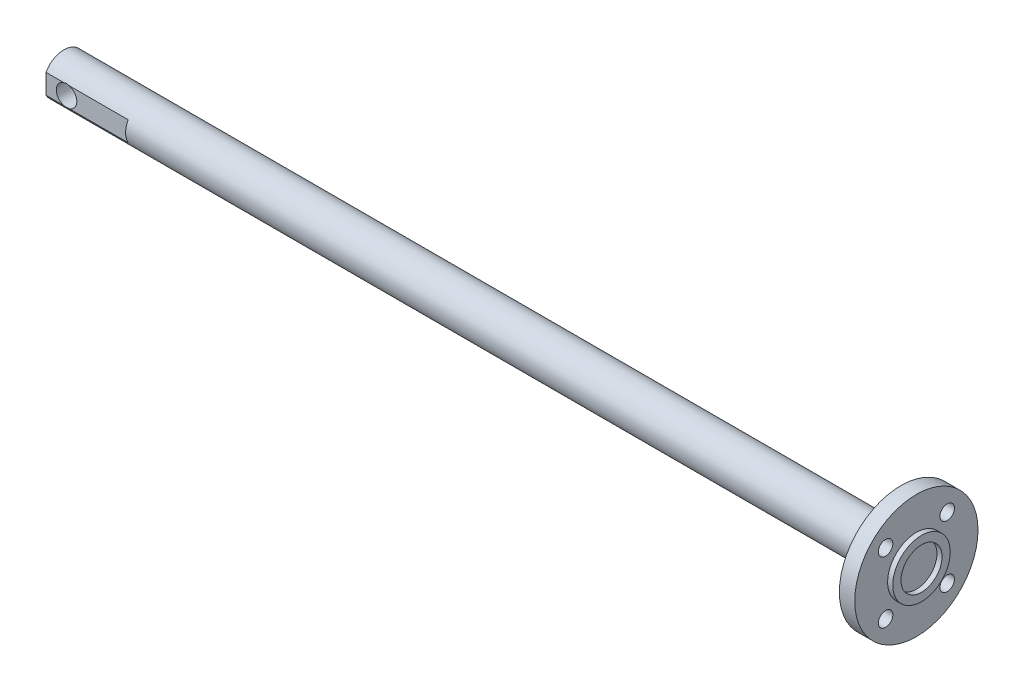
ISO-10303-21;
HEADER;
FILE_DESCRIPTION(('STEP AP214'),'2;1');
FILE_NAME('part.step','',(''),(''),'','','');
FILE_SCHEMA(('AUTOMOTIVE_DESIGN { 1 0 10303 214 1 1 1 1 }'));
ENDSEC;
DATA;
#1=APPLICATION_CONTEXT('core data for automotive mechanical design processes');
#2=APPLICATION_PROTOCOL_DEFINITION('international standard','automotive_design',2000,#1);
#3=PRODUCT_CONTEXT('',#1,'mechanical');
#4=PRODUCT('Part','Part','',(#3));
#5=PRODUCT_RELATED_PRODUCT_CATEGORY('part','',(#4));
#6=PRODUCT_DEFINITION_FORMATION('','',#4);
#7=PRODUCT_DEFINITION_CONTEXT('part definition',#1,'design');
#8=PRODUCT_DEFINITION('design','',#6,#7);
#9=PRODUCT_DEFINITION_SHAPE('','',#8);
#10=(LENGTH_UNIT() NAMED_UNIT(*) SI_UNIT(.MILLI.,.METRE.));
#11=(NAMED_UNIT(*) PLANE_ANGLE_UNIT() SI_UNIT($,.RADIAN.));
#12=(NAMED_UNIT(*) SI_UNIT($,.STERADIAN.) SOLID_ANGLE_UNIT());
#13=UNCERTAINTY_MEASURE_WITH_UNIT(LENGTH_MEASURE(1.E-05),#10,'distance_accuracy_value','');
#14=(GEOMETRIC_REPRESENTATION_CONTEXT(3) GLOBAL_UNCERTAINTY_ASSIGNED_CONTEXT((#13)) GLOBAL_UNIT_ASSIGNED_CONTEXT((#10,
#11,#12)) REPRESENTATION_CONTEXT('',''));
#15=CARTESIAN_POINT('',(0.,0.,0.));
#16=DIRECTION('',(0.,0.,1.));
#17=DIRECTION('',(1.,0.,0.));
#18=AXIS2_PLACEMENT_3D('',#15,#16,#17);
#19=CARTESIAN_POINT('',(263.525,0.,0.));
#20=DIRECTION('',(1.,0.,0.));
#21=DIRECTION('',(0.,0.,-1.));
#22=AXIS2_PLACEMENT_3D('',#19,#20,#21);
#23=PLANE('',#22);
#24=CARTESIAN_POINT('',(263.525,9.525,9.525));
#25=DIRECTION('',(1.,0.,0.));
#26=DIRECTION('',(0.,0.,-1.));
#27=AXIS2_PLACEMENT_3D('',#24,#25,#26);
#28=CIRCLE('',#27,2.2479);
#29=CARTESIAN_POINT('',(263.525,9.525,7.27710000000001));
#30=VERTEX_POINT('',#29);
#31=EDGE_CURVE('E211',#30,#30,#28,.T.);
#32=ORIENTED_EDGE('',*,*,#31,.F.);
#33=EDGE_LOOP('',(#32));
#34=FACE_BOUND('',#33,.T.);
#35=CARTESIAN_POINT('',(263.525,-9.525,-9.525));
#36=DIRECTION('',(1.,0.,0.));
#37=DIRECTION('',(0.,0.,-1.));
#38=AXIS2_PLACEMENT_3D('',#35,#36,#37);
#39=CIRCLE('',#38,2.2479);
#40=CARTESIAN_POINT('',(263.525,-9.525,-11.7729));
#41=VERTEX_POINT('',#40);
#42=EDGE_CURVE('E205',#41,#41,#39,.T.);
#43=ORIENTED_EDGE('',*,*,#42,.F.);
#44=EDGE_LOOP('',(#43));
#45=FACE_BOUND('',#44,.T.);
#46=CARTESIAN_POINT('',(263.525,9.525,-9.525));
#47=DIRECTION('',(1.,0.,0.));
#48=DIRECTION('',(0.,0.,-1.));
#49=AXIS2_PLACEMENT_3D('',#46,#47,#48);
#50=CIRCLE('',#49,2.2479);
#51=CARTESIAN_POINT('',(263.525,9.525,-11.7729));
#52=VERTEX_POINT('',#51);
#53=EDGE_CURVE('E199',#52,#52,#50,.T.);
#54=ORIENTED_EDGE('',*,*,#53,.F.);
#55=EDGE_LOOP('',(#54));
#56=FACE_BOUND('',#55,.T.);
#57=CARTESIAN_POINT('',(263.525,-9.525,9.525));
#58=DIRECTION('',(1.,0.,0.));
#59=DIRECTION('',(0.,0.,-1.));
#60=AXIS2_PLACEMENT_3D('',#57,#58,#59);
#61=CIRCLE('',#60,2.2479);
#62=CARTESIAN_POINT('',(263.525,-9.525,7.27710000000001));
#63=VERTEX_POINT('',#62);
#64=EDGE_CURVE('E175',#63,#63,#61,.T.);
#65=ORIENTED_EDGE('',*,*,#64,.F.);
#66=EDGE_LOOP('',(#65));
#67=FACE_BOUND('',#66,.T.);
#68=CARTESIAN_POINT('',(263.525,0.,0.));
#69=DIRECTION('',(1.,0.,0.));
#70=DIRECTION('',(0.,0.,-1.));
#71=AXIS2_PLACEMENT_3D('',#68,#69,#70);
#72=CIRCLE('',#71,19.05);
#73=CARTESIAN_POINT('',(263.525,0.,-19.05));
#74=VERTEX_POINT('',#73);
#75=EDGE_CURVE('E134',#74,#74,#72,.T.);
#76=ORIENTED_EDGE('',*,*,#75,.T.);
#77=EDGE_LOOP('',(#76));
#78=FACE_BOUND('',#77,.T.);
#79=CARTESIAN_POINT('',(263.525,0.,0.));
#80=DIRECTION('',(1.,0.,0.));
#81=DIRECTION('',(0.,0.,-1.));
#82=AXIS2_PLACEMENT_3D('',#79,#80,#81);
#83=CIRCLE('',#82,8.89);
#84=CARTESIAN_POINT('',(263.525,0.,-8.89));
#85=VERTEX_POINT('',#84);
#86=EDGE_CURVE('E218',#85,#85,#83,.T.);
#87=ORIENTED_EDGE('',*,*,#86,.F.);
#88=EDGE_LOOP('',(#87));
#89=FACE_BOUND('',#88,.T.);
#90=ADVANCED_FACE('F32',(#34,#45,#56,#67,#78,#89),#23,.T.);
#91=CARTESIAN_POINT('',(0.,-19.05,-5.55625));
#92=DIRECTION('',(0.,0.,1.));
#93=DIRECTION('',(1.,0.,0.));
#94=AXIS2_PLACEMENT_3D('',#91,#92,#93);
#95=PLANE('',#94);
#96=CARTESIAN_POINT('',(6.35,0.,-5.55625));
#97=DIRECTION('',(0.,0.,-1.));
#98=DIRECTION('',(-1.,0.,0.));
#99=AXIS2_PLACEMENT_3D('',#96,#97,#98);
#100=CIRCLE('',#99,3.17499999999999);
#101=CARTESIAN_POINT('',(7.14374999999996,3.07418053105213,-5.55625));
#102=VERTEX_POINT('',#101);
#103=CARTESIAN_POINT('',(7.14374999999996,-3.07418053105213,-5.55625));
#104=VERTEX_POINT('',#103);
#105=EDGE_CURVE('E97',#102,#104,#100,.T.);
#106=ORIENTED_EDGE('',*,*,#105,.F.);
#107=DIRECTION('',(-1.,0.,0.));
#108=VECTOR('',#107,1.);
#109=CARTESIAN_POINT('',(-16.5206638695174,3.07418053105214,-5.55625));
#110=LINE('',#109,#108);
#111=CARTESIAN_POINT('',(25.4,3.07418053105213,-5.55625));
#112=VERTEX_POINT('',#111);
#113=EDGE_CURVE('E109',#102,#112,#110,.F.);
#114=ORIENTED_EDGE('',*,*,#113,.T.);
#115=DIRECTION('',(0.,1.,0.));
#116=VECTOR('',#115,1.);
#117=CARTESIAN_POINT('',(25.4,-19.05,-5.55625));
#118=LINE('',#117,#116);
#119=CARTESIAN_POINT('',(25.4,-3.07418053105215,-5.55625));
#120=VERTEX_POINT('',#119);
#121=EDGE_CURVE('E178',#120,#112,#118,.T.);
#122=ORIENTED_EDGE('',*,*,#121,.F.);
#123=DIRECTION('',(-1.,0.,0.));
#124=VECTOR('',#123,1.);
#125=CARTESIAN_POINT('',(-16.5206638695174,-3.07418053105214,-5.55625));
#126=LINE('',#125,#124);
#127=EDGE_CURVE('E112',#120,#104,#126,.T.);
#128=ORIENTED_EDGE('',*,*,#127,.T.);
#129=EDGE_LOOP('',(#106,#114,#122,#128));
#130=FACE_BOUND('',#129,.T.);
#131=ADVANCED_FACE('F107',(#130),#95,.F.);
#132=CARTESIAN_POINT('',(5.55625000000004,-3.07418053105213,-5.55625));
#133=VERTEX_POINT('',#132);
#134=CARTESIAN_POINT('',(5.55625000000006,3.07418053105214,-5.55625));
#135=VERTEX_POINT('',#134);
#136=EDGE_CURVE('E47',#133,#135,#100,.T.);
#137=ORIENTED_EDGE('',*,*,#136,.F.);
#138=CARTESIAN_POINT('',(0.,-3.07418053105214,-5.55625));
#139=VERTEX_POINT('',#138);
#140=EDGE_CURVE('E121',#133,#139,#126,.T.);
#141=ORIENTED_EDGE('',*,*,#140,.T.);
#142=DIRECTION('',(0.,-1.,0.));
#143=VECTOR('',#142,1.);
#144=CARTESIAN_POINT('',(0.,0.,-5.55625));
#145=LINE('',#144,#143);
#146=CARTESIAN_POINT('',(0.,3.07418053105213,-5.55625));
#147=VERTEX_POINT('',#146);
#148=EDGE_CURVE('E137',#147,#139,#145,.T.);
#149=ORIENTED_EDGE('',*,*,#148,.F.);
#150=EDGE_CURVE('E118',#147,#135,#110,.F.);
#151=ORIENTED_EDGE('',*,*,#150,.T.);
#152=EDGE_LOOP('',(#137,#141,#149,#151));
#153=FACE_BOUND('',#152,.T.);
#154=ADVANCED_FACE('F173',(#153),#95,.F.);
#155=CARTESIAN_POINT('',(0.,-19.05,5.55625));
#156=DIRECTION('',(0.,0.,-1.));
#157=DIRECTION('',(-1.,0.,0.));
#158=AXIS2_PLACEMENT_3D('',#155,#156,#157);
#159=PLANE('',#158);
#160=DIRECTION('',(-1.,0.,0.));
#161=VECTOR('',#160,1.);
#162=CARTESIAN_POINT('',(-16.5206638695174,3.07418053105214,5.55625));
#163=LINE('',#162,#161);
#164=CARTESIAN_POINT('',(25.4,3.07418053105214,5.55625));
#165=VERTEX_POINT('',#164);
#166=CARTESIAN_POINT('',(7.14374999999994,3.07418053105214,5.55625));
#167=VERTEX_POINT('',#166);
#168=EDGE_CURVE('E185',#165,#167,#163,.T.);
#169=ORIENTED_EDGE('',*,*,#168,.T.);
#170=CARTESIAN_POINT('',(6.35,0.,5.55625));
#171=DIRECTION('',(0.,0.,-1.));
#172=DIRECTION('',(-1.,0.,0.));
#173=AXIS2_PLACEMENT_3D('',#170,#171,#172);
#174=CIRCLE('',#173,3.17499999999999);
#175=CARTESIAN_POINT('',(7.14374999999994,-3.07418053105214,5.55625));
#176=VERTEX_POINT('',#175);
#177=EDGE_CURVE('E192',#167,#176,#174,.T.);
#178=ORIENTED_EDGE('',*,*,#177,.T.);
#179=DIRECTION('',(-1.,0.,0.));
#180=VECTOR('',#179,1.);
#181=CARTESIAN_POINT('',(-16.5206638695174,-3.07418053105214,5.55625));
#182=LINE('',#181,#180);
#183=CARTESIAN_POINT('',(25.4,-3.07418053105214,5.55625));
#184=VERTEX_POINT('',#183);
#185=EDGE_CURVE('E182',#176,#184,#182,.F.);
#186=ORIENTED_EDGE('',*,*,#185,.T.);
#187=DIRECTION('',(0.,1.,0.));
#188=VECTOR('',#187,1.);
#189=CARTESIAN_POINT('',(25.4,-19.05,5.55625));
#190=LINE('',#189,#188);
#191=EDGE_CURVE('E189',#184,#165,#190,.T.);
#192=ORIENTED_EDGE('',*,*,#191,.T.);
#193=EDGE_LOOP('',(#169,#178,#186,#192));
#194=FACE_BOUND('',#193,.T.);
#195=ADVANCED_FACE('F340',(#194),#159,.F.);
#196=CARTESIAN_POINT('',(263.525,0.,0.));
#197=DIRECTION('',(-1.,0.,0.));
#198=DIRECTION('',(0.,0.,1.));
#199=AXIS2_PLACEMENT_3D('',#196,#197,#198);
#200=CYLINDRICAL_SURFACE('',#199,19.05);
#201=ORIENTED_EDGE('',*,*,#75,.F.);
#202=EDGE_LOOP('',(#201));
#203=FACE_BOUND('',#202,.T.);
#204=CARTESIAN_POINT('',(258.7625,0.,0.));
#205=DIRECTION('',(-1.,0.,0.));
#206=DIRECTION('',(0.,0.,1.));
#207=AXIS2_PLACEMENT_3D('',#204,#205,#206);
#208=CIRCLE('',#207,19.05);
#209=CARTESIAN_POINT('',(258.7625,0.,19.05));
#210=VERTEX_POINT('',#209);
#211=EDGE_CURVE('E120',#210,#210,#208,.T.);
#212=ORIENTED_EDGE('',*,*,#211,.F.);
#213=EDGE_LOOP('',(#212));
#214=FACE_BOUND('',#213,.T.);
#215=ADVANCED_FACE('F34',(#203,#214),#200,.T.);
#216=CARTESIAN_POINT('',(-16.5206638695174,0.,0.));
#217=DIRECTION('',(-1.,0.,0.));
#218=DIRECTION('',(0.,0.,1.));
#219=AXIS2_PLACEMENT_3D('',#216,#217,#218);
#220=CYLINDRICAL_SURFACE('',#219,6.35);
#221=CARTESIAN_POINT('',(7.14374999999996,-3.07418053105214,-5.55625));
#222=CARTESIAN_POINT('',(7.06724573834244,-3.09394573682989,-5.54530326829618));
#223=CARTESIAN_POINT('',(6.98979244902954,-3.11088593896028,-5.53580306432637));
#224=CARTESIAN_POINT('',(6.83349752086504,-3.1389716298177,-5.51993211680947));
#225=CARTESIAN_POINT('',(6.7546553624178,-3.15011490009601,-5.51356257139676));
#226=CARTESIAN_POINT('',(6.59805268366542,-3.16625080572854,-5.50431039399035));
#227=CARTESIAN_POINT('',(6.52031157965077,-3.17138455989439,-5.50134778906265));
#228=CARTESIAN_POINT('',(6.3646484706526,-3.17592115020808,-5.49872994876561));
#229=CARTESIAN_POINT('',(6.28672654637229,-3.17532618088666,-5.49907344691083));
#230=CARTESIAN_POINT('',(6.09942029753634,-3.16699163319004,-5.50388144041737));
#231=CARTESIAN_POINT('',(5.9901801183416,-3.15643410467398,-5.50997127067524));
#232=CARTESIAN_POINT('',(5.827087752603,-3.13213839515719,-5.52379304067881));
#233=CARTESIAN_POINT('',(5.77237979871466,-3.12250817982089,-5.52924997394033));
#234=CARTESIAN_POINT('',(5.66371738369593,-3.10043723768752,-5.54165560495079));
#235=CARTESIAN_POINT('',(5.60976275500805,-3.08799714679888,-5.54860396515432));
#236=CARTESIAN_POINT('',(5.55625000000004,-3.07418053105214,-5.55625));
#237=B_SPLINE_CURVE_WITH_KNOTS('',3,(#221,#222,#223,#224,#225,#226,#227,#228,#229,#230,#231,
#232,#233,#234,#235,#236),.UNSPECIFIED.,.F.,.F.,(4,2,2,2,2,2,2,4),(0.,0.239262180475478,
0.478615857822642,0.712228367182657,0.945751388992468,1.27462161298976,1.44199117350151,
1.60932289416568),.UNSPECIFIED.);
#238=EDGE_CURVE('E40',#104,#133,#237,.T.);
#239=ORIENTED_EDGE('',*,*,#238,.F.);
#240=ORIENTED_EDGE('',*,*,#127,.F.);
#241=CARTESIAN_POINT('',(25.4,0.,0.));
#242=DIRECTION('',(1.,0.,0.));
#243=DIRECTION('',(0.,0.,-1.));
#244=AXIS2_PLACEMENT_3D('',#241,#242,#243);
#245=CIRCLE('',#244,6.35);
#246=EDGE_CURVE('E116',#112,#120,#245,.F.);
#247=ORIENTED_EDGE('',*,*,#246,.F.);
#248=ORIENTED_EDGE('',*,*,#113,.F.);
#249=CARTESIAN_POINT('',(5.55625000000004,3.07418053105214,-5.55625));
#250=CARTESIAN_POINT('',(5.63275426165756,3.09394573682989,-5.54530326829618));
#251=CARTESIAN_POINT('',(5.71020755097046,3.11088593896028,-5.53580306432637));
#252=CARTESIAN_POINT('',(5.86650247913496,3.1389716298177,-5.51993211680947));
#253=CARTESIAN_POINT('',(5.9453446375822,3.15011490009601,-5.51356257139676));
#254=CARTESIAN_POINT('',(6.10194731633458,3.16625080572854,-5.50431039399035));
#255=CARTESIAN_POINT('',(6.17968842034923,3.17138455989439,-5.50134778906265));
#256=CARTESIAN_POINT('',(6.3353515293474,3.17592115020808,-5.49872994876561));
#257=CARTESIAN_POINT('',(6.41327345362771,3.17532618088666,-5.49907344691083));
#258=CARTESIAN_POINT('',(6.60057970246366,3.16699163319004,-5.50388144041737));
#259=CARTESIAN_POINT('',(6.7098198816584,3.15643410467398,-5.50997127067524));
#260=CARTESIAN_POINT('',(6.872912247397,3.13213839515719,-5.52379304067881));
#261=CARTESIAN_POINT('',(6.92762020128534,3.12250817982089,-5.52924997394033));
#262=CARTESIAN_POINT('',(7.03628261630407,3.10043723768752,-5.54165560495079));
#263=CARTESIAN_POINT('',(7.09023724499195,3.08799714679888,-5.54860396515432));
#264=CARTESIAN_POINT('',(7.14374999999996,3.07418053105214,-5.55625));
#265=B_SPLINE_CURVE_WITH_KNOTS('',3,(#249,#250,#251,#252,#253,#254,#255,#256,#257,#258,#259,
#260,#261,#262,#263,#264),.UNSPECIFIED.,.F.,.F.,(4,2,2,2,2,2,2,4),(0.,0.239262180475478,
0.478615857822642,0.712228367182656,0.945751388992468,1.27462161298976,1.44199117350151,
1.60932289416568),.UNSPECIFIED.);
#266=EDGE_CURVE('E94',#135,#102,#265,.T.);
#267=ORIENTED_EDGE('',*,*,#266,.F.);
#268=ORIENTED_EDGE('',*,*,#150,.F.);
#269=CARTESIAN_POINT('',(0.,0.,0.));
#270=DIRECTION('',(-1.,0.,0.));
#271=DIRECTION('',(0.,0.,1.));
#272=AXIS2_PLACEMENT_3D('',#269,#270,#271);
#273=CIRCLE('',#272,6.35);
#274=CARTESIAN_POINT('',(0.,3.07418053105214,5.55625));
#275=VERTEX_POINT('',#274);
#276=EDGE_CURVE('E130',#275,#147,#273,.T.);
#277=ORIENTED_EDGE('',*,*,#276,.F.);
#278=CARTESIAN_POINT('',(5.55625000000006,3.07418053105214,5.55625));
#279=VERTEX_POINT('',#278);
#280=EDGE_CURVE('E188',#279,#275,#163,.T.);
#281=ORIENTED_EDGE('',*,*,#280,.F.);
#282=CARTESIAN_POINT('',(9.52499999999999,0.,6.35));
#283=CARTESIAN_POINT('',(9.52499911228236,0.0834969220594995,6.34999931166444));
#284=CARTESIAN_POINT('',(9.52170012555403,0.167002655580041,6.34834758911701));
#285=CARTESIAN_POINT('',(9.50855412545009,0.33337833025878,6.34179105821714));
#286=CARTESIAN_POINT('',(9.49870426347422,0.41624797895577,6.33688483467113));
#287=CARTESIAN_POINT('',(9.45942793495398,0.663182030647008,6.31742426748325));
#288=CARTESIAN_POINT('',(9.42027492259859,0.825450146761551,6.29812827299425));
#289=CARTESIAN_POINT('',(9.31800928870584,1.13965128900425,6.2489182313574));
#290=CARTESIAN_POINT('',(9.25498978075658,1.29162180811868,6.21904547786825));
#291=CARTESIAN_POINT('',(9.10726392637109,1.58264035037879,6.15142812041637));
#292=CARTESIAN_POINT('',(9.02255928984903,1.72168939123018,6.11368413715877));
#293=CARTESIAN_POINT('',(8.82803037026577,1.99234108848171,6.03111096182982));
#294=CARTESIAN_POINT('',(8.71699642220606,2.12298433900091,5.98599127270818));
#295=CARTESIAN_POINT('',(8.4756033164272,2.36467069069853,5.89470535591056));
#296=CARTESIAN_POINT('',(8.34522957023355,2.4756988560132,5.84853836069044));
#297=CARTESIAN_POINT('',(8.05657905224668,2.68368848497885,5.75623634934465));
#298=CARTESIAN_POINT('',(7.8969224686984,2.77889135161933,5.71038146176788));
#299=CARTESIAN_POINT('',(7.64545201282556,2.90019349951533,5.64919759286364));
#300=CARTESIAN_POINT('',(7.55959993817132,2.93705266116891,5.63006420805933));
#301=CARTESIAN_POINT('',(7.38441438629357,3.00322508739605,5.59504604853268));
#302=CARTESIAN_POINT('',(7.29508300181944,3.03254280972158,5.57915935583429));
#303=CARTESIAN_POINT('',(7.11898944803525,3.08174263292981,5.55212611635049));
#304=CARTESIAN_POINT('',(7.03238920597143,3.10208128111977,5.54075429137746));
#305=CARTESIAN_POINT('',(6.8574127210056,3.13545600360764,5.52193654886445));
#306=CARTESIAN_POINT('',(6.7690374462283,3.14849595237256,5.51448854851136));
#307=CARTESIAN_POINT('',(6.59129326115138,3.16707713053439,5.50383875782919));
#308=CARTESIAN_POINT('',(6.5019249820126,3.17262287599648,5.50063441026522));
#309=CARTESIAN_POINT('',(6.32301921582191,3.17614778806992,5.4985978839861));
#310=CARTESIAN_POINT('',(6.23348174572866,3.1741276765987,5.49976528812799));
#311=CARTESIAN_POINT('',(5.98725212427559,3.15811930330259,5.50899190362733));
#312=CARTESIAN_POINT('',(5.83115827018664,3.13621253452964,5.52160857357708));
#313=CARTESIAN_POINT('',(5.52535335869347,3.07003746372167,5.55866493052825));
#314=CARTESIAN_POINT('',(5.37564435097724,3.02576203854503,5.58310838358077));
#315=CARTESIAN_POINT('',(5.08245570343586,2.91531509833646,5.64157885407237));
#316=CARTESIAN_POINT('',(4.93920239006338,2.84865758129416,5.6758158387613));
#317=CARTESIAN_POINT('',(4.66523391382599,2.69570761526053,5.75003268807633));
#318=CARTESIAN_POINT('',(4.5345244203915,2.60940634674628,5.79001512927804));
#319=CARTESIAN_POINT('',(4.27189572574971,2.40685964249564,5.87734289018611));
#320=CARTESIAN_POINT('',(4.1419246151435,2.28820488335252,5.92497898403936));
#321=CARTESIAN_POINT('',(3.90291485713616,2.03058898448426,6.01813700574905));
#322=CARTESIAN_POINT('',(3.79388621364131,1.89161819563545,6.06365791538158));
#323=CARTESIAN_POINT('',(3.59509808028029,1.58913989972482,6.1500381059768));
#324=CARTESIAN_POINT('',(3.50646851442007,1.42479265164788,6.19058274974572));
#325=CARTESIAN_POINT('',(3.35884191836466,1.08098023585582,6.25976272299952));
#326=CARTESIAN_POINT('',(3.2998213588683,0.901527205073891,6.28840750578946));
#327=CARTESIAN_POINT('',(3.21794059660096,0.54853361062683,6.32854759690357));
#328=CARTESIAN_POINT('',(3.19249032741267,0.375734359385242,6.34126679122995));
#329=CARTESIAN_POINT('',(3.17034947773975,0.0278752299448297,6.35231817716325));
#330=CARTESIAN_POINT('',(3.17364527286069,-0.14718353806002,6.35065718436129));
#331=CARTESIAN_POINT('',(3.2074062359454,-0.480164686080363,6.33384535408399));
#332=CARTESIAN_POINT('',(3.23574579147485,-0.638363620564189,6.31975005060431));
#333=CARTESIAN_POINT('',(3.31545587820991,-0.947441883053,6.28085393924121));
#334=CARTESIAN_POINT('',(3.3668289484773,-1.09832040207141,6.25605195113515));
#335=CARTESIAN_POINT('',(3.49249513093781,-1.39347133182512,6.19709998236334));
#336=CARTESIAN_POINT('',(3.56740158411121,-1.53743151047822,6.16270299610718));
#337=CARTESIAN_POINT('',(3.73731642568589,-1.8112148234104,6.08787118465665));
#338=CARTESIAN_POINT('',(3.83233337738542,-1.94103189959927,6.0474337895468));
#339=CARTESIAN_POINT('',(4.05053935037378,-2.19636241342679,5.95973602709939));
#340=CARTESIAN_POINT('',(4.17557860711158,-2.32020134681979,5.91219559251098));
#341=CARTESIAN_POINT('',(4.44476235514976,-2.54589381918873,5.81858093231368));
#342=CARTESIAN_POINT('',(4.58891995238094,-2.6477321493525,5.77250773963547));
#343=CARTESIAN_POINT('',(4.90106860195836,-2.83117262876715,5.68487535288742));
#344=CARTESIAN_POINT('',(5.06987576951039,-2.91155594998013,5.64364281441822));
#345=CARTESIAN_POINT('',(5.42134446488968,-3.04191297152938,5.5744767953732));
#346=CARTESIAN_POINT('',(5.60398779784739,-3.09192585492219,5.54652618900869));
#347=CARTESIAN_POINT('',(5.95918995647017,-3.15551086037917,5.51057765714603));
#348=CARTESIAN_POINT('',(6.13103375040722,-3.1721202730971,5.50092192343245));
#349=CARTESIAN_POINT('',(6.47524444249521,-3.17718805563875,5.49800001145359));
#350=CARTESIAN_POINT('',(6.64761108154264,-3.16565862768384,5.50472672904441));
#351=CARTESIAN_POINT('',(6.97066010307391,-3.11761548073657,5.53205211477785));
#352=CARTESIAN_POINT('',(7.12184394173115,-3.08358651207685,5.5512682307627));
#353=CARTESIAN_POINT('',(7.41619083016717,-2.99458164828806,5.59977978302582));
#354=CARTESIAN_POINT('',(7.5593512828503,-2.93959901505998,5.62907846127336));
#355=CARTESIAN_POINT('',(7.84423369942855,-2.80611544421369,5.69685576337175));
#356=CARTESIAN_POINT('',(7.98521280936567,-2.72628260503928,5.73581889480533));
#357=CARTESIAN_POINT('',(8.2526974317231,-2.54682759156582,5.81772207082383));
#358=CARTESIAN_POINT('',(8.3791953599427,-2.4471951216993,5.86066417820131));
#359=CARTESIAN_POINT('',(8.63009752417706,-2.21680287661217,5.95192753761204));
#360=CARTESIAN_POINT('',(8.75237975641279,-2.08373188558711,6.00026839877347));
#361=CARTESIAN_POINT('',(8.97339787323311,-1.79751265125242,6.0921234557675));
#362=CARTESIAN_POINT('',(9.07212106598271,-1.64435365457427,6.13563504323043));
#363=CARTESIAN_POINT('',(9.20028026619706,-1.40178715704486,6.19391073190243));
#364=CARTESIAN_POINT('',(9.23980058368138,-1.31842200030917,6.21223173271384));
#365=CARTESIAN_POINT('',(9.31159947482369,-1.14807701021669,6.24595363475604));
#366=CARTESIAN_POINT('',(9.34388160653436,-1.06109897786305,6.26135597012704));
#367=CARTESIAN_POINT('',(9.40075934591499,-0.884361322813098,6.28875097111981));
#368=CARTESIAN_POINT('',(9.4253717181381,-0.794608244970563,6.30075106809478));
#369=CARTESIAN_POINT('',(9.46666738952988,-0.612925661591574,6.32100983571903));
#370=CARTESIAN_POINT('',(9.48335553219353,-0.520997521680282,6.3292707916836));
#371=CARTESIAN_POINT('',(9.50561628486238,-0.357531347524369,6.34032503263334));
#372=CARTESIAN_POINT('',(9.51287882124962,-0.286274046488592,6.34394670812889));
#373=CARTESIAN_POINT('',(9.52257112653756,-0.143346668941345,6.34878452045567));
#374=CARTESIAN_POINT('',(9.52500076204682,-0.0716765810914249,6.35000059089052));
#375=CARTESIAN_POINT('',(9.52499999999999,0.,6.35));
#376=B_SPLINE_CURVE_WITH_KNOTS('',3,(#282,#283,#284,#285,#286,#287,#288,#289,#290,#291,#292,
#293,#294,#295,#296,#297,#298,#299,#300,#301,#302,#303,#304,#305,#306,#307,#308,#309,#310,#311,
#312,#313,#314,#315,#316,#317,#318,#319,#320,#321,#322,#323,#324,#325,#326,#327,#328,#329,#330,
#331,#332,#333,#334,#335,#336,#337,#338,#339,#340,#341,#342,#343,#344,#345,#346,#347,#348,#349,
#350,#351,#352,#353,#354,#355,#356,#357,#358,#359,#360,#361,#362,#363,#364,#365,#366,#367,#368,
#369,#370,#371,#372,#373,#374,#375),.UNSPECIFIED.,.T.,.F.,(4,2,2,2,2,2,2,2,2,2,2,2,2,2,2,2,2,2,
2,2,2,2,2,2,2,2,2,2,2,2,2,2,2,2,2,2,2,2,2,2,2,2,2,2,2,2,4),(0.,0.250415612102679,
0.500940186864012,1.00234854488128,1.50182051324263,2.00125310940106,2.53090025348451,
3.06094897410614,3.63210298373097,3.91787290005987,4.20347350732848,4.47213270490101,
4.74064915090146,5.00900371453885,5.27733267302574,5.74927594687736,6.22136960256844,
6.70445970327762,7.18776712794018,7.73235646527878,8.27720530143643,8.84735553323663,
9.41705196489301,9.93956405039335,10.4618285011675,10.9436138594975,11.4254523397102,
11.9210677568139,12.4168946391879,12.9614122158798,13.5063050164601,14.0775857365549,
14.6481278321882,15.1639000911418,15.6794487286236,16.1458838633213,16.6124691169502,
17.1104020806942,17.6085946442304,18.1673210354481,18.7263477502426,19.0082017078364,
19.2899168101042,19.5710117490932,19.8519346536843,20.0668939492147,20.2818591776892),.UNSPECIFIED.);
#377=EDGE_CURVE('E103',#167,#279,#376,.T.);
#378=ORIENTED_EDGE('',*,*,#377,.F.);
#379=ORIENTED_EDGE('',*,*,#168,.F.);
#380=CARTESIAN_POINT('',(25.4,0.,0.));
#381=DIRECTION('',(1.,0.,0.));
#382=DIRECTION('',(0.,0.,-1.));
#383=AXIS2_PLACEMENT_3D('',#380,#381,#382);
#384=CIRCLE('',#383,6.35);
#385=EDGE_CURVE('E144',#184,#165,#384,.F.);
#386=ORIENTED_EDGE('',*,*,#385,.F.);
#387=ORIENTED_EDGE('',*,*,#185,.F.);
#388=CARTESIAN_POINT('',(5.55625000000006,-3.07418053105214,5.55625));
#389=VERTEX_POINT('',#388);
#390=EDGE_CURVE('E146',#389,#176,#376,.T.);
#391=ORIENTED_EDGE('',*,*,#390,.F.);
#392=CARTESIAN_POINT('',(0.,-3.07418053105215,5.55625));
#393=VERTEX_POINT('',#392);
#394=EDGE_CURVE('E179',#393,#389,#182,.F.);
#395=ORIENTED_EDGE('',*,*,#394,.F.);
#396=EDGE_CURVE('E131',#139,#393,#273,.T.);
#397=ORIENTED_EDGE('',*,*,#396,.F.);
#398=ORIENTED_EDGE('',*,*,#140,.F.);
#399=EDGE_LOOP('',(#239,#240,#247,#248,#267,#268,#277,#281,#378,#379,#386,#387,#391,#395,#397,#398));
#400=FACE_BOUND('',#399,.T.);
#401=CARTESIAN_POINT('',(258.7625,0.,0.));
#402=DIRECTION('',(-1.,0.,0.));
#403=DIRECTION('',(0.,0.,1.));
#404=AXIS2_PLACEMENT_3D('',#401,#402,#403);
#405=CIRCLE('',#404,6.35);
#406=CARTESIAN_POINT('',(258.7625,0.,6.35));
#407=VERTEX_POINT('',#406);
#408=EDGE_CURVE('E127',#407,#407,#405,.T.);
#409=ORIENTED_EDGE('',*,*,#408,.T.);
#410=EDGE_LOOP('',(#409));
#411=FACE_BOUND('',#410,.T.);
#412=ADVANCED_FACE('F114',(#400,#411),#220,.T.);
#413=CARTESIAN_POINT('',(258.7625,6.35,0.));
#414=DIRECTION('',(-1.,0.,0.));
#415=DIRECTION('',(0.,0.,1.));
#416=AXIS2_PLACEMENT_3D('',#413,#414,#415);
#417=PLANE('',#416);
#418=CARTESIAN_POINT('',(258.7625,9.525,9.525));
#419=DIRECTION('',(-1.,0.,0.));
#420=DIRECTION('',(0.,0.,1.));
#421=AXIS2_PLACEMENT_3D('',#418,#419,#420);
#422=CIRCLE('',#421,2.2479);
#423=CARTESIAN_POINT('',(258.7625,9.525,11.7729));
#424=VERTEX_POINT('',#423);
#425=EDGE_CURVE('E214',#424,#424,#422,.T.);
#426=ORIENTED_EDGE('',*,*,#425,.F.);
#427=EDGE_LOOP('',(#426));
#428=FACE_BOUND('',#427,.T.);
#429=CARTESIAN_POINT('',(258.7625,-9.525,-9.525));
#430=DIRECTION('',(-1.,0.,0.));
#431=DIRECTION('',(0.,0.,1.));
#432=AXIS2_PLACEMENT_3D('',#429,#430,#431);
#433=CIRCLE('',#432,2.2479);
#434=CARTESIAN_POINT('',(258.7625,-9.525,-7.2771));
#435=VERTEX_POINT('',#434);
#436=EDGE_CURVE('E208',#435,#435,#433,.T.);
#437=ORIENTED_EDGE('',*,*,#436,.F.);
#438=EDGE_LOOP('',(#437));
#439=FACE_BOUND('',#438,.T.);
#440=CARTESIAN_POINT('',(258.7625,9.525,-9.525));
#441=DIRECTION('',(-1.,0.,0.));
#442=DIRECTION('',(0.,0.,1.));
#443=AXIS2_PLACEMENT_3D('',#440,#441,#442);
#444=CIRCLE('',#443,2.2479);
#445=CARTESIAN_POINT('',(258.7625,9.525,-7.2771));
#446=VERTEX_POINT('',#445);
#447=EDGE_CURVE('E202',#446,#446,#444,.T.);
#448=ORIENTED_EDGE('',*,*,#447,.F.);
#449=EDGE_LOOP('',(#448));
#450=FACE_BOUND('',#449,.T.);
#451=CARTESIAN_POINT('',(258.7625,-9.525,9.525));
#452=DIRECTION('',(-1.,0.,0.));
#453=DIRECTION('',(0.,0.,1.));
#454=AXIS2_PLACEMENT_3D('',#451,#452,#453);
#455=CIRCLE('',#454,2.2479);
#456=CARTESIAN_POINT('',(258.7625,-9.525,11.7729));
#457=VERTEX_POINT('',#456);
#458=EDGE_CURVE('E196',#457,#457,#455,.T.);
#459=ORIENTED_EDGE('',*,*,#458,.F.);
#460=EDGE_LOOP('',(#459));
#461=FACE_BOUND('',#460,.T.);
#462=ORIENTED_EDGE('',*,*,#211,.T.);
#463=EDGE_LOOP('',(#462));
#464=FACE_BOUND('',#463,.T.);
#465=ORIENTED_EDGE('',*,*,#408,.F.);
#466=EDGE_LOOP('',(#465));
#467=FACE_BOUND('',#466,.T.);
#468=ADVANCED_FACE('F313',(#428,#439,#450,#461,#464,#467),#417,.T.);
#469=CARTESIAN_POINT('',(0.,0.,0.));
#470=DIRECTION('',(1.,0.,0.));
#471=DIRECTION('',(0.,0.,-1.));
#472=AXIS2_PLACEMENT_3D('',#469,#470,#471);
#473=PLANE('',#472);
#474=ORIENTED_EDGE('',*,*,#396,.T.);
#475=DIRECTION('',(0.,1.,0.));
#476=VECTOR('',#475,1.);
#477=CARTESIAN_POINT('',(0.,0.,5.55625));
#478=LINE('',#477,#476);
#479=EDGE_CURVE('E141',#393,#275,#478,.T.);
#480=ORIENTED_EDGE('',*,*,#479,.T.);
#481=ORIENTED_EDGE('',*,*,#276,.T.);
#482=ORIENTED_EDGE('',*,*,#148,.T.);
#483=EDGE_LOOP('',(#474,#480,#481,#482));
#484=FACE_BOUND('',#483,.T.);
#485=ADVANCED_FACE('F318',(#484),#473,.F.);
#486=CARTESIAN_POINT('',(25.4,-19.05,-6.35));
#487=DIRECTION('',(1.,0.,0.));
#488=DIRECTION('',(0.,0.,-1.));
#489=AXIS2_PLACEMENT_3D('',#486,#487,#488);
#490=PLANE('',#489);
#491=ORIENTED_EDGE('',*,*,#246,.T.);
#492=ORIENTED_EDGE('',*,*,#121,.T.);
#493=EDGE_LOOP('',(#491,#492));
#494=FACE_BOUND('',#493,.T.);
#495=ADVANCED_FACE('F338',(#494),#490,.F.);
#496=ORIENTED_EDGE('',*,*,#394,.T.);
#497=EDGE_CURVE('E55',#389,#279,#174,.T.);
#498=ORIENTED_EDGE('',*,*,#497,.T.);
#499=ORIENTED_EDGE('',*,*,#280,.T.);
#500=ORIENTED_EDGE('',*,*,#479,.F.);
#501=EDGE_LOOP('',(#496,#498,#499,#500));
#502=FACE_BOUND('',#501,.T.);
#503=ADVANCED_FACE('F164',(#502),#159,.F.);
#504=CARTESIAN_POINT('',(25.4,-19.05,6.35));
#505=DIRECTION('',(1.,0.,0.));
#506=DIRECTION('',(0.,0.,-1.));
#507=AXIS2_PLACEMENT_3D('',#504,#505,#506);
#508=PLANE('',#507);
#509=ORIENTED_EDGE('',*,*,#191,.F.);
#510=ORIENTED_EDGE('',*,*,#385,.T.);
#511=EDGE_LOOP('',(#509,#510));
#512=FACE_BOUND('',#511,.T.);
#513=ADVANCED_FACE('F162',(#512),#508,.F.);
#514=CARTESIAN_POINT('',(6.35,0.,-5.55625));
#515=DIRECTION('',(0.,0.,-1.));
#516=DIRECTION('',(-1.,0.,0.));
#517=AXIS2_PLACEMENT_3D('',#514,#515,#516);
#518=CYLINDRICAL_SURFACE('',#517,3.17499999999999);
#519=ORIENTED_EDGE('',*,*,#238,.T.);
#520=ORIENTED_EDGE('',*,*,#136,.T.);
#521=ORIENTED_EDGE('',*,*,#266,.T.);
#522=ORIENTED_EDGE('',*,*,#105,.T.);
#523=EDGE_LOOP('',(#519,#520,#521,#522));
#524=FACE_BOUND('',#523,.T.);
#525=ORIENTED_EDGE('',*,*,#377,.T.);
#526=ORIENTED_EDGE('',*,*,#497,.F.);
#527=ORIENTED_EDGE('',*,*,#390,.T.);
#528=ORIENTED_EDGE('',*,*,#177,.F.);
#529=EDGE_LOOP('',(#525,#526,#527,#528));
#530=FACE_BOUND('',#529,.T.);
#531=ADVANCED_FACE('F96',(#524,#530),#518,.F.);
#532=CARTESIAN_POINT('',(258.7625,-9.525,9.525));
#533=DIRECTION('',(-1.,0.,0.));
#534=DIRECTION('',(0.,0.,1.));
#535=AXIS2_PLACEMENT_3D('',#532,#533,#534);
#536=CYLINDRICAL_SURFACE('',#535,2.2479);
#537=ORIENTED_EDGE('',*,*,#64,.T.);
#538=EDGE_LOOP('',(#537));
#539=FACE_BOUND('',#538,.T.);
#540=ORIENTED_EDGE('',*,*,#458,.T.);
#541=EDGE_LOOP('',(#540));
#542=FACE_BOUND('',#541,.T.);
#543=ADVANCED_FACE('F161',(#539,#542),#536,.F.);
#544=CARTESIAN_POINT('',(258.7625,9.525,-9.525));
#545=DIRECTION('',(-1.,0.,0.));
#546=DIRECTION('',(0.,0.,1.));
#547=AXIS2_PLACEMENT_3D('',#544,#545,#546);
#548=CYLINDRICAL_SURFACE('',#547,2.2479);
#549=ORIENTED_EDGE('',*,*,#53,.T.);
#550=EDGE_LOOP('',(#549));
#551=FACE_BOUND('',#550,.T.);
#552=ORIENTED_EDGE('',*,*,#447,.T.);
#553=EDGE_LOOP('',(#552));
#554=FACE_BOUND('',#553,.T.);
#555=ADVANCED_FACE('F290',(#551,#554),#548,.F.);
#556=CARTESIAN_POINT('',(258.7625,-9.525,-9.525));
#557=DIRECTION('',(-1.,0.,0.));
#558=DIRECTION('',(0.,0.,1.));
#559=AXIS2_PLACEMENT_3D('',#556,#557,#558);
#560=CYLINDRICAL_SURFACE('',#559,2.2479);
#561=ORIENTED_EDGE('',*,*,#42,.T.);
#562=EDGE_LOOP('',(#561));
#563=FACE_BOUND('',#562,.T.);
#564=ORIENTED_EDGE('',*,*,#436,.T.);
#565=EDGE_LOOP('',(#564));
#566=FACE_BOUND('',#565,.T.);
#567=ADVANCED_FACE('F242',(#563,#566),#560,.F.);
#568=CARTESIAN_POINT('',(258.7625,9.525,9.525));
#569=DIRECTION('',(-1.,0.,0.));
#570=DIRECTION('',(0.,0.,1.));
#571=AXIS2_PLACEMENT_3D('',#568,#569,#570);
#572=CYLINDRICAL_SURFACE('',#571,2.2479);
#573=ORIENTED_EDGE('',*,*,#31,.T.);
#574=EDGE_LOOP('',(#573));
#575=FACE_BOUND('',#574,.T.);
#576=ORIENTED_EDGE('',*,*,#425,.T.);
#577=EDGE_LOOP('',(#576));
#578=FACE_BOUND('',#577,.T.);
#579=ADVANCED_FACE('F233',(#575,#578),#572,.F.);
#580=CARTESIAN_POINT('',(265.1125,0.,0.));
#581=DIRECTION('',(1.,0.,0.));
#582=DIRECTION('',(0.,0.,-1.));
#583=AXIS2_PLACEMENT_3D('',#580,#581,#582);
#584=PLANE('',#583);
#585=CARTESIAN_POINT('',(265.1125,0.,0.));
#586=DIRECTION('',(1.,0.,0.));
#587=DIRECTION('',(0.,0.,-1.));
#588=AXIS2_PLACEMENT_3D('',#585,#586,#587);
#589=CIRCLE('',#588,8.89);
#590=CARTESIAN_POINT('',(265.1125,0.,-8.89));
#591=VERTEX_POINT('',#590);
#592=EDGE_CURVE('E217',#591,#591,#589,.T.);
#593=ORIENTED_EDGE('',*,*,#592,.T.);
#594=EDGE_LOOP('',(#593));
#595=FACE_BOUND('',#594,.T.);
#596=CARTESIAN_POINT('',(265.1125,0.,0.));
#597=DIRECTION('',(1.,0.,0.));
#598=DIRECTION('',(0.,0.,-1.));
#599=AXIS2_PLACEMENT_3D('',#596,#597,#598);
#600=CIRCLE('',#599,6.35);
#601=CARTESIAN_POINT('',(265.1125,0.,-6.35));
#602=VERTEX_POINT('',#601);
#603=EDGE_CURVE('E221',#602,#602,#600,.T.);
#604=ORIENTED_EDGE('',*,*,#603,.F.);
#605=EDGE_LOOP('',(#604));
#606=FACE_BOUND('',#605,.T.);
#607=ADVANCED_FACE('F230',(#595,#606),#584,.T.);
#608=CARTESIAN_POINT('',(265.1125,0.,0.));
#609=DIRECTION('',(-1.,0.,0.));
#610=DIRECTION('',(0.,0.,1.));
#611=AXIS2_PLACEMENT_3D('',#608,#609,#610);
#612=CYLINDRICAL_SURFACE('',#611,8.89);
#613=ORIENTED_EDGE('',*,*,#592,.F.);
#614=EDGE_LOOP('',(#613));
#615=FACE_BOUND('',#614,.T.);
#616=ORIENTED_EDGE('',*,*,#86,.T.);
#617=EDGE_LOOP('',(#616));
#618=FACE_BOUND('',#617,.T.);
#619=ADVANCED_FACE('F232',(#615,#618),#612,.T.);
#620=CARTESIAN_POINT('',(265.1125,0.,0.));
#621=DIRECTION('',(-1.,0.,0.));
#622=DIRECTION('',(0.,0.,1.));
#623=AXIS2_PLACEMENT_3D('',#620,#621,#622);
#624=CYLINDRICAL_SURFACE('',#623,6.35);
#625=ORIENTED_EDGE('',*,*,#603,.T.);
#626=EDGE_LOOP('',(#625));
#627=FACE_BOUND('',#626,.T.);
#628=CARTESIAN_POINT('',(263.525,0.,0.));
#629=DIRECTION('',(1.,0.,0.));
#630=DIRECTION('',(0.,0.,-1.));
#631=AXIS2_PLACEMENT_3D('',#628,#629,#630);
#632=CIRCLE('',#631,6.35);
#633=CARTESIAN_POINT('',(263.525,0.,-6.35));
#634=VERTEX_POINT('',#633);
#635=EDGE_CURVE('E11',#634,#634,#632,.F.);
#636=ORIENTED_EDGE('',*,*,#635,.T.);
#637=EDGE_LOOP('',(#636));
#638=FACE_BOUND('',#637,.T.);
#639=ADVANCED_FACE('F227',(#627,#638),#624,.F.);
#640=ORIENTED_EDGE('',*,*,#635,.F.);
#641=EDGE_LOOP('',(#640));
#642=FACE_BOUND('',#641,.T.);
#643=ADVANCED_FACE('F248',(#642),#23,.T.);
#644=CLOSED_SHELL('',(#90,#131,#154,#195,#215,#412,#468,#485,#495,#503,#513,#531,#543,#555,#567,
#579,#607,#619,#639,#643));
#645=MANIFOLD_SOLID_BREP('B2',#644);
#646=ADVANCED_BREP_SHAPE_REPRESENTATION('',(#18,#645),#14);
#647=SHAPE_DEFINITION_REPRESENTATION(#9,#646);
ENDSEC;
END-ISO-10303-21;
